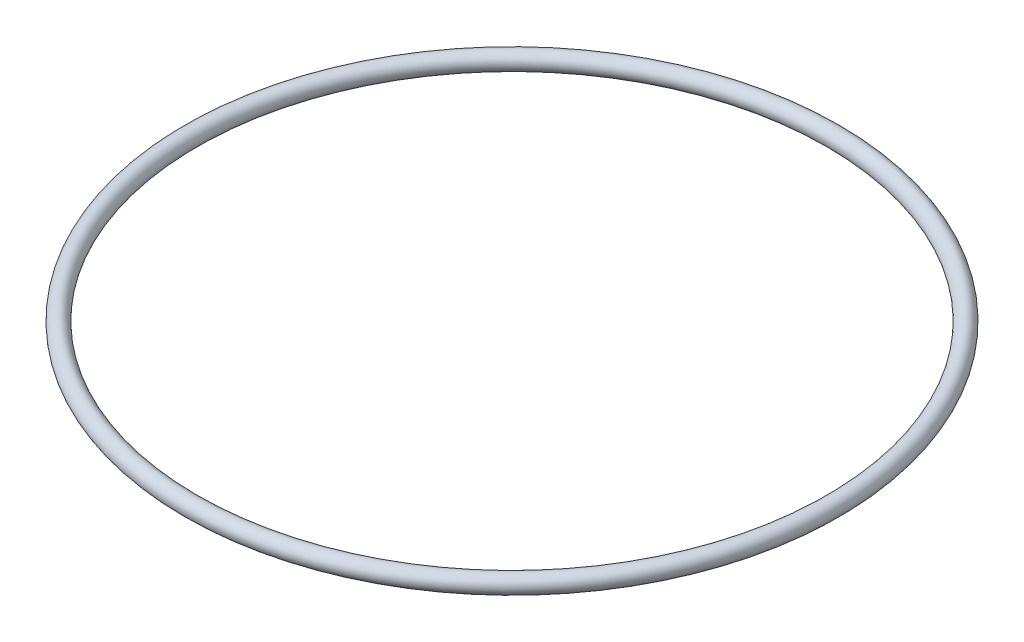
ISO-10303-21;
HEADER;
FILE_DESCRIPTION(('STEP AP214'),'2;1');
FILE_NAME('part.step','',(''),(''),'','','');
FILE_SCHEMA(('AUTOMOTIVE_DESIGN { 1 0 10303 214 1 1 1 1 }'));
ENDSEC;
DATA;
#1=APPLICATION_CONTEXT('core data for automotive mechanical design processes');
#2=APPLICATION_PROTOCOL_DEFINITION('international standard','automotive_design',2000,#1);
#3=PRODUCT_CONTEXT('',#1,'mechanical');
#4=PRODUCT('Part','Part','',(#3));
#5=PRODUCT_RELATED_PRODUCT_CATEGORY('part','',(#4));
#6=PRODUCT_DEFINITION_FORMATION('','',#4);
#7=PRODUCT_DEFINITION_CONTEXT('part definition',#1,'design');
#8=PRODUCT_DEFINITION('design','',#6,#7);
#9=PRODUCT_DEFINITION_SHAPE('','',#8);
#10=(LENGTH_UNIT() NAMED_UNIT(*) SI_UNIT(.MILLI.,.METRE.));
#11=(NAMED_UNIT(*) PLANE_ANGLE_UNIT() SI_UNIT($,.RADIAN.));
#12=(NAMED_UNIT(*) SI_UNIT($,.STERADIAN.) SOLID_ANGLE_UNIT());
#13=UNCERTAINTY_MEASURE_WITH_UNIT(LENGTH_MEASURE(1.E-05),#10,'distance_accuracy_value','');
#14=(GEOMETRIC_REPRESENTATION_CONTEXT(3) GLOBAL_UNCERTAINTY_ASSIGNED_CONTEXT((#13)) GLOBAL_UNIT_ASSIGNED_CONTEXT((#10,
#11,#12)) REPRESENTATION_CONTEXT('',''));
#15=CARTESIAN_POINT('',(0.,0.,0.));
#16=DIRECTION('',(0.,0.,1.));
#17=DIRECTION('',(1.,0.,0.));
#18=AXIS2_PLACEMENT_3D('',#15,#16,#17);
#19=CARTESIAN_POINT('',(0.,0.,0.));
#20=DIRECTION('',(0.,1.,0.));
#21=DIRECTION('',(0.,0.,1.));
#22=AXIS2_PLACEMENT_3D('',#19,#20,#21);
#23=TOROIDAL_SURFACE('',#22,54.70587299,1.5);
#24=CARTESIAN_POINT('',(0.,0.,56.20587299));
#25=VERTEX_POINT('',#24);
#26=VERTEX_LOOP('',#25);
#27=FACE_BOUND('',#26,.T.);
#28=ADVANCED_FACE('F30',(#27),#23,.T.);
#29=CLOSED_SHELL('',(#28));
#30=MANIFOLD_SOLID_BREP('B2',#29);
#31=ADVANCED_BREP_SHAPE_REPRESENTATION('',(#18,#30),#14);
#32=SHAPE_DEFINITION_REPRESENTATION(#9,#31);
ENDSEC;
END-ISO-10303-21;
